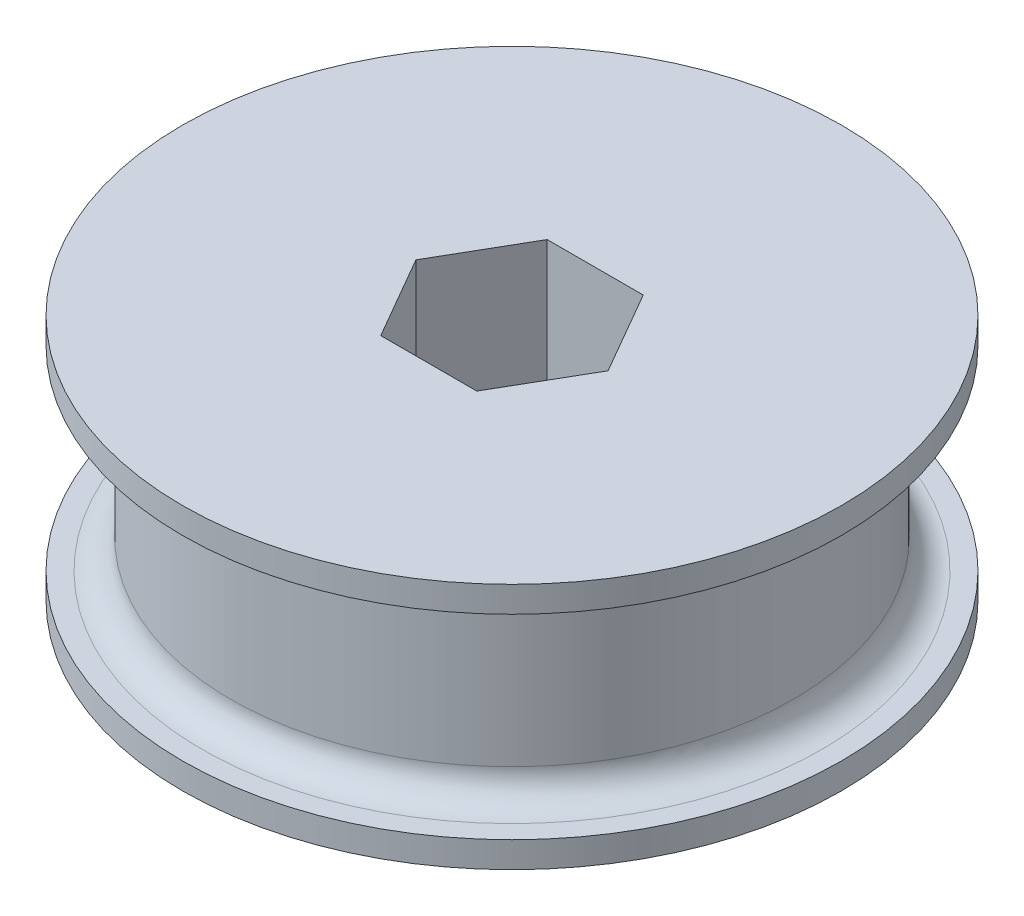
ISO-10303-21;
HEADER;
FILE_DESCRIPTION(('STEP AP214'),'2;1');
FILE_NAME('part.step','',(''),(''),'','','');
FILE_SCHEMA(('AUTOMOTIVE_DESIGN { 1 0 10303 214 1 1 1 1 }'));
ENDSEC;
DATA;
#1=APPLICATION_CONTEXT('core data for automotive mechanical design processes');
#2=APPLICATION_PROTOCOL_DEFINITION('international standard','automotive_design',2000,#1);
#3=PRODUCT_CONTEXT('',#1,'mechanical');
#4=PRODUCT('Part','Part','',(#3));
#5=PRODUCT_RELATED_PRODUCT_CATEGORY('part','',(#4));
#6=PRODUCT_DEFINITION_FORMATION('','',#4);
#7=PRODUCT_DEFINITION_CONTEXT('part definition',#1,'design');
#8=PRODUCT_DEFINITION('design','',#6,#7);
#9=PRODUCT_DEFINITION_SHAPE('','',#8);
#10=(LENGTH_UNIT() NAMED_UNIT(*) SI_UNIT(.MILLI.,.METRE.));
#11=(NAMED_UNIT(*) PLANE_ANGLE_UNIT() SI_UNIT($,.RADIAN.));
#12=(NAMED_UNIT(*) SI_UNIT($,.STERADIAN.) SOLID_ANGLE_UNIT());
#13=UNCERTAINTY_MEASURE_WITH_UNIT(LENGTH_MEASURE(1.E-05),#10,'distance_accuracy_value','');
#14=(GEOMETRIC_REPRESENTATION_CONTEXT(3) GLOBAL_UNCERTAINTY_ASSIGNED_CONTEXT((#13)) GLOBAL_UNIT_ASSIGNED_CONTEXT((#10,
#11,#12)) REPRESENTATION_CONTEXT('',''));
#15=CARTESIAN_POINT('',(0.,0.,0.));
#16=DIRECTION('',(0.,0.,1.));
#17=DIRECTION('',(1.,0.,0.));
#18=AXIS2_PLACEMENT_3D('',#15,#16,#17);
#19=CARTESIAN_POINT('',(0.,19.05,0.));
#20=DIRECTION('',(0.,-1.,0.));
#21=DIRECTION('',(0.,0.,-1.));
#22=AXIS2_PLACEMENT_3D('',#19,#20,#21);
#23=CYLINDRICAL_SURFACE('',#22,25.4);
#24=CARTESIAN_POINT('',(0.,2.00025,0.));
#25=DIRECTION('',(0.,-1.,0.));
#26=DIRECTION('',(0.,0.,-1.));
#27=AXIS2_PLACEMENT_3D('',#24,#25,#26);
#28=CIRCLE('',#27,25.4);
#29=CARTESIAN_POINT('',(0.,2.00025,-25.4));
#30=VERTEX_POINT('',#29);
#31=EDGE_CURVE('E111',#30,#30,#28,.T.);
#32=CARTESIAN_POINT('',(0.,0.,0.));
#33=DIRECTION('',(0.,1.,0.));
#34=DIRECTION('',(0.,0.,1.));
#35=AXIS2_PLACEMENT_3D('',#32,#33,#34);
#36=CIRCLE('',#35,25.4);
#37=CARTESIAN_POINT('',(0.,0.,-25.4));
#38=VERTEX_POINT('',#37);
#39=EDGE_CURVE('E37',#38,#38,#36,.T.);
#40=CARTESIAN_POINT('',(0.,2.00025,-25.4));
#41=CARTESIAN_POINT('',(0.,1.9794140625,-25.4));
#42=CARTESIAN_POINT('',(0.,1.958578125,-25.4));
#43=CARTESIAN_POINT('',(0.,1.91690625,-25.4));
#44=CARTESIAN_POINT('',(0.,1.8960703125,-25.4));
#45=CARTESIAN_POINT('',(0.,1.8543984375,-25.4));
#46=CARTESIAN_POINT('',(0.,1.8335625,-25.4));
#47=CARTESIAN_POINT('',(0.,1.791890625,-25.4));
#48=CARTESIAN_POINT('',(0.,1.7710546875,-25.4));
#49=CARTESIAN_POINT('',(0.,1.7293828125,-25.4));
#50=CARTESIAN_POINT('',(0.,1.708546875,-25.4));
#51=CARTESIAN_POINT('',(0.,1.666875,-25.4));
#52=CARTESIAN_POINT('',(0.,1.6460390625,-25.4));
#53=CARTESIAN_POINT('',(0.,1.6043671875,-25.4));
#54=CARTESIAN_POINT('',(0.,1.58353125,-25.4));
#55=CARTESIAN_POINT('',(0.,1.541859375,-25.4));
#56=CARTESIAN_POINT('',(0.,1.5210234375,-25.4));
#57=CARTESIAN_POINT('',(0.,1.4793515625,-25.4));
#58=CARTESIAN_POINT('',(0.,1.458515625,-25.4));
#59=CARTESIAN_POINT('',(0.,1.41684375,-25.4));
#60=CARTESIAN_POINT('',(0.,1.3960078125,-25.4));
#61=CARTESIAN_POINT('',(0.,1.3543359375,-25.4));
#62=CARTESIAN_POINT('',(0.,1.3335,-25.4));
#63=CARTESIAN_POINT('',(0.,1.291828125,-25.4));
#64=CARTESIAN_POINT('',(0.,1.2709921875,-25.4));
#65=CARTESIAN_POINT('',(0.,1.2293203125,-25.4));
#66=CARTESIAN_POINT('',(0.,1.208484375,-25.4));
#67=CARTESIAN_POINT('',(0.,1.1668125,-25.4));
#68=CARTESIAN_POINT('',(0.,1.1459765625,-25.4));
#69=CARTESIAN_POINT('',(0.,1.1043046875,-25.4));
#70=CARTESIAN_POINT('',(0.,1.08346875,-25.4));
#71=CARTESIAN_POINT('',(0.,1.041796875,-25.4));
#72=CARTESIAN_POINT('',(0.,1.0209609375,-25.4));
#73=CARTESIAN_POINT('',(0.,0.979289062500001,-25.4));
#74=CARTESIAN_POINT('',(0.,0.958453125,-25.4));
#75=CARTESIAN_POINT('',(0.,0.916781250000001,-25.4));
#76=CARTESIAN_POINT('',(0.,0.895945312500001,-25.4));
#77=CARTESIAN_POINT('',(0.,0.854273437500002,-25.4));
#78=CARTESIAN_POINT('',(0.,0.833437500000001,-25.4));
#79=CARTESIAN_POINT('',(0.,0.791765625000001,-25.4));
#80=CARTESIAN_POINT('',(0.,0.7709296875,-25.4));
#81=CARTESIAN_POINT('',(0.,0.729257812500001,-25.4));
#82=CARTESIAN_POINT('',(0.,0.708421875000001,-25.4));
#83=CARTESIAN_POINT('',(0.,0.666750000000002,-25.4));
#84=CARTESIAN_POINT('',(0.,0.645914062500001,-25.4));
#85=CARTESIAN_POINT('',(0.,0.604242187500001,-25.4));
#86=CARTESIAN_POINT('',(0.,0.58340625,-25.4));
#87=CARTESIAN_POINT('',(0.,0.541734375000001,-25.4));
#88=CARTESIAN_POINT('',(0.,0.520898437500002,-25.4));
#89=CARTESIAN_POINT('',(0.,0.479226562500002,-25.4));
#90=CARTESIAN_POINT('',(0.,0.458390625000001,-25.4));
#91=CARTESIAN_POINT('',(0.,0.416718750000001,-25.4));
#92=CARTESIAN_POINT('',(0.,0.3958828125,-25.4));
#93=CARTESIAN_POINT('',(0.,0.3542109375,-25.4));
#94=CARTESIAN_POINT('',(0.,0.333374999999999,-25.4));
#95=CARTESIAN_POINT('',(0.,0.291703125,-25.4));
#96=CARTESIAN_POINT('',(0.,0.2708671875,-25.4));
#97=CARTESIAN_POINT('',(0.,0.229195312500001,-25.4));
#98=CARTESIAN_POINT('',(0.,0.208359375,-25.4));
#99=CARTESIAN_POINT('',(0.,0.1666875,-25.4));
#100=CARTESIAN_POINT('',(0.,0.145851562499999,-25.4));
#101=CARTESIAN_POINT('',(0.,0.1041796875,-25.4));
#102=CARTESIAN_POINT('',(0.,0.0833437500000004,-25.4));
#103=CARTESIAN_POINT('',(0.,0.0416718750000008,-25.4));
#104=CARTESIAN_POINT('',(0.,0.0208359375000004,-25.4));
#105=CARTESIAN_POINT('',(0.,0.,-25.4));
#106=B_SPLINE_CURVE_WITH_KNOTS('',3,(#40,#41,#42,#43,#44,#45,#46,#47,#48,#49,#50,#51,#52,#53,
#54,#55,#56,#57,#58,#59,#60,#61,#62,#63,#64,#65,#66,#67,#68,#69,#70,#71,#72,#73,#74,#75,#76,#77,
#78,#79,#80,#81,#82,#83,#84,#85,#86,#87,#88,#89,#90,#91,#92,#93,#94,#95,#96,#97,#98,#99,#100,
#101,#102,#103,#104,#105),.UNSPECIFIED.,.F.,.F.,(4,2,2,2,2,2,2,2,2,2,2,2,2,2,2,2,2,2,2,2,2,2,2,
2,2,2,2,2,2,2,2,2,4),(0.,0.0625078125000011,0.125015624999999,0.1875234375,0.250031250000001,
0.312539062499999,0.375046875,0.437554687500001,0.500062500000002,0.5625703125,
0.625078125000001,0.687585937500002,0.75009375,0.812601562500001,0.875109375000002,0.9376171875,
1.000125,1.0626328125,1.125140625,1.1876484375,1.25015625,1.3126640625,1.375171875,1.4376796875,
1.5001875,1.5626953125,1.625203125,1.6877109375,1.75021875,1.8127265625,1.875234375,
1.9377421875,2.00025),.UNSPECIFIED.);
#107=EDGE_CURVE('BSEAM33',#30,#38,#106,.T.);
#108=ORIENTED_EDGE('',*,*,#31,.T.);
#109=ORIENTED_EDGE('',*,*,#39,.T.);
#110=ORIENTED_EDGE('',*,*,#107,.T.);
#111=ORIENTED_EDGE('',*,*,#107,.F.);
#112=EDGE_LOOP('',(#108,#110,#109,#111));
#113=FACE_BOUND('',#112,.T.);
#114=ADVANCED_FACE('F33',(#113),#23,.T.);
#115=CARTESIAN_POINT('',(0.,19.05,0.));
#116=DIRECTION('',(0.,1.,0.));
#117=DIRECTION('',(0.,0.,1.));
#118=AXIS2_PLACEMENT_3D('',#115,#116,#117);
#119=PLANE('',#118);
#120=DIRECTION('',(1.,0.,0.));
#121=VECTOR('',#120,1.);
#122=CARTESIAN_POINT('',(-3.70283595144767,19.05,6.4135));
#123=LINE('',#122,#121);
#124=CARTESIAN_POINT('',(-3.70283595144767,19.05,6.4135));
#125=VERTEX_POINT('',#124);
#126=CARTESIAN_POINT('',(3.70283595144767,19.05,6.4135));
#127=VERTEX_POINT('',#126);
#128=EDGE_CURVE('E48',#125,#127,#123,.T.);
#129=ORIENTED_EDGE('',*,*,#128,.F.);
#130=DIRECTION('',(0.5,0.,0.866025403784439));
#131=VECTOR('',#130,1.);
#132=CARTESIAN_POINT('',(-7.40567190289533,19.05,0.));
#133=LINE('',#132,#131);
#134=CARTESIAN_POINT('',(-7.40567190289533,19.05,0.));
#135=VERTEX_POINT('',#134);
#136=EDGE_CURVE('E105',#135,#125,#133,.T.);
#137=ORIENTED_EDGE('',*,*,#136,.F.);
#138=DIRECTION('',(-0.5,0.,0.866025403784439));
#139=VECTOR('',#138,1.);
#140=CARTESIAN_POINT('',(-3.70283595144767,19.05,-6.4135));
#141=LINE('',#140,#139);
#142=CARTESIAN_POINT('',(-3.70283595144767,19.05,-6.4135));
#143=VERTEX_POINT('',#142);
#144=EDGE_CURVE('E108',#143,#135,#141,.T.);
#145=ORIENTED_EDGE('',*,*,#144,.F.);
#146=DIRECTION('',(-1.,0.,0.));
#147=VECTOR('',#146,1.);
#148=CARTESIAN_POINT('',(3.70283595144766,19.05,-6.4135));
#149=LINE('',#148,#147);
#150=CARTESIAN_POINT('',(3.70283595144766,19.05,-6.4135));
#151=VERTEX_POINT('',#150);
#152=EDGE_CURVE('E127',#151,#143,#149,.T.);
#153=ORIENTED_EDGE('',*,*,#152,.F.);
#154=DIRECTION('',(-0.5,0.,-0.866025403784439));
#155=VECTOR('',#154,1.);
#156=CARTESIAN_POINT('',(7.40567190289533,19.05,0.));
#157=LINE('',#156,#155);
#158=CARTESIAN_POINT('',(7.40567190289533,19.05,0.));
#159=VERTEX_POINT('',#158);
#160=EDGE_CURVE('E124',#159,#151,#157,.T.);
#161=ORIENTED_EDGE('',*,*,#160,.F.);
#162=DIRECTION('',(0.5,0.,-0.866025403784439));
#163=VECTOR('',#162,1.);
#164=CARTESIAN_POINT('',(3.70283595144767,19.05,6.4135));
#165=LINE('',#164,#163);
#166=EDGE_CURVE('E122',#127,#159,#165,.T.);
#167=ORIENTED_EDGE('',*,*,#166,.F.);
#168=EDGE_LOOP('',(#129,#137,#145,#153,#161,#167));
#169=FACE_BOUND('',#168,.T.);
#170=CARTESIAN_POINT('',(0.,19.05,0.));
#171=DIRECTION('',(0.,1.,0.));
#172=DIRECTION('',(0.,0.,1.));
#173=AXIS2_PLACEMENT_3D('',#170,#171,#172);
#174=CIRCLE('',#173,25.4);
#175=CARTESIAN_POINT('',(0.,19.05,-25.4));
#176=VERTEX_POINT('',#175);
#177=EDGE_CURVE('E11',#176,#176,#174,.T.);
#178=ORIENTED_EDGE('',*,*,#177,.T.);
#179=EDGE_LOOP('',(#178));
#180=FACE_BOUND('',#179,.T.);
#181=ADVANCED_FACE('F144',(#169,#180),#119,.T.);
#182=CARTESIAN_POINT('',(0.,0.,0.));
#183=DIRECTION('',(0.,1.,0.));
#184=DIRECTION('',(0.,0.,1.));
#185=AXIS2_PLACEMENT_3D('',#182,#183,#184);
#186=PLANE('',#185);
#187=DIRECTION('',(0.5,0.,0.866025403784439));
#188=VECTOR('',#187,1.);
#189=CARTESIAN_POINT('',(-7.40567190289533,0.,0.));
#190=LINE('',#189,#188);
#191=CARTESIAN_POINT('',(-7.40567190289533,0.,0.));
#192=VERTEX_POINT('',#191);
#193=CARTESIAN_POINT('',(-3.70283595144767,0.,6.4135));
#194=VERTEX_POINT('',#193);
#195=EDGE_CURVE('E94',#192,#194,#190,.T.);
#196=ORIENTED_EDGE('',*,*,#195,.T.);
#197=DIRECTION('',(1.,0.,0.));
#198=VECTOR('',#197,1.);
#199=CARTESIAN_POINT('',(-3.70283595144767,0.,6.4135));
#200=LINE('',#199,#198);
#201=CARTESIAN_POINT('',(3.70283595144767,0.,6.4135));
#202=VERTEX_POINT('',#201);
#203=EDGE_CURVE('E88',#194,#202,#200,.T.);
#204=ORIENTED_EDGE('',*,*,#203,.T.);
#205=DIRECTION('',(0.5,0.,-0.866025403784439));
#206=VECTOR('',#205,1.);
#207=CARTESIAN_POINT('',(3.70283595144767,0.,6.4135));
#208=LINE('',#207,#206);
#209=CARTESIAN_POINT('',(7.40567190289533,0.,0.));
#210=VERTEX_POINT('',#209);
#211=EDGE_CURVE('E97',#202,#210,#208,.T.);
#212=ORIENTED_EDGE('',*,*,#211,.T.);
#213=DIRECTION('',(-0.5,0.,-0.866025403784439));
#214=VECTOR('',#213,1.);
#215=CARTESIAN_POINT('',(7.40567190289533,0.,0.));
#216=LINE('',#215,#214);
#217=CARTESIAN_POINT('',(3.70283595144766,0.,-6.4135));
#218=VERTEX_POINT('',#217);
#219=EDGE_CURVE('E56',#210,#218,#216,.T.);
#220=ORIENTED_EDGE('',*,*,#219,.T.);
#221=DIRECTION('',(-1.,0.,0.));
#222=VECTOR('',#221,1.);
#223=CARTESIAN_POINT('',(3.70283595144766,0.,-6.4135));
#224=LINE('',#223,#222);
#225=CARTESIAN_POINT('',(-3.70283595144767,0.,-6.4135));
#226=VERTEX_POINT('',#225);
#227=EDGE_CURVE('E115',#218,#226,#224,.T.);
#228=ORIENTED_EDGE('',*,*,#227,.T.);
#229=DIRECTION('',(-0.5,0.,0.866025403784439));
#230=VECTOR('',#229,1.);
#231=CARTESIAN_POINT('',(-3.70283595144767,0.,-6.4135));
#232=LINE('',#231,#230);
#233=EDGE_CURVE('E118',#226,#192,#232,.T.);
#234=ORIENTED_EDGE('',*,*,#233,.T.);
#235=EDGE_LOOP('',(#196,#204,#212,#220,#228,#234));
#236=FACE_BOUND('',#235,.T.);
#237=ORIENTED_EDGE('',*,*,#39,.F.);
#238=EDGE_LOOP('',(#237));
#239=FACE_BOUND('',#238,.T.);
#240=ADVANCED_FACE('F101',(#236,#239),#186,.F.);
#241=CARTESIAN_POINT('',(0.,17.04975,0.));
#242=DIRECTION('',(0.,-1.,0.));
#243=DIRECTION('',(0.,0.,-1.));
#244=AXIS2_PLACEMENT_3D('',#241,#242,#243);
#245=CIRCLE('',#244,25.4);
#246=CARTESIAN_POINT('',(0.,17.04975,-25.4));
#247=VERTEX_POINT('',#246);
#248=EDGE_CURVE('E181',#247,#247,#245,.T.);
#249=CARTESIAN_POINT('',(0.,17.04975,-25.4));
#250=CARTESIAN_POINT('',(0.,17.0705859375,-25.4));
#251=CARTESIAN_POINT('',(0.,17.091421875,-25.4));
#252=CARTESIAN_POINT('',(0.,17.13309375,-25.4));
#253=CARTESIAN_POINT('',(0.,17.1539296875,-25.4));
#254=CARTESIAN_POINT('',(0.,17.1956015625,-25.4));
#255=CARTESIAN_POINT('',(0.,17.2164375,-25.4));
#256=CARTESIAN_POINT('',(0.,17.258109375,-25.4));
#257=CARTESIAN_POINT('',(0.,17.2789453125,-25.4));
#258=CARTESIAN_POINT('',(0.,17.3206171875,-25.4));
#259=CARTESIAN_POINT('',(0.,17.341453125,-25.4));
#260=CARTESIAN_POINT('',(0.,17.383125,-25.4));
#261=CARTESIAN_POINT('',(0.,17.4039609375,-25.4));
#262=CARTESIAN_POINT('',(0.,17.4456328125,-25.4));
#263=CARTESIAN_POINT('',(0.,17.46646875,-25.4));
#264=CARTESIAN_POINT('',(0.,17.508140625,-25.4));
#265=CARTESIAN_POINT('',(0.,17.5289765625,-25.4));
#266=CARTESIAN_POINT('',(0.,17.5706484375,-25.4));
#267=CARTESIAN_POINT('',(0.,17.591484375,-25.4));
#268=CARTESIAN_POINT('',(0.,17.63315625,-25.4));
#269=CARTESIAN_POINT('',(0.,17.6539921875,-25.4));
#270=CARTESIAN_POINT('',(0.,17.6956640625,-25.4));
#271=CARTESIAN_POINT('',(0.,17.7165,-25.4));
#272=CARTESIAN_POINT('',(0.,17.758171875,-25.4));
#273=CARTESIAN_POINT('',(0.,17.7790078125,-25.4));
#274=CARTESIAN_POINT('',(0.,17.8206796875,-25.4));
#275=CARTESIAN_POINT('',(0.,17.841515625,-25.4));
#276=CARTESIAN_POINT('',(0.,17.8831875,-25.4));
#277=CARTESIAN_POINT('',(0.,17.9040234375,-25.4));
#278=CARTESIAN_POINT('',(0.,17.9456953125,-25.4));
#279=CARTESIAN_POINT('',(0.,17.96653125,-25.4));
#280=CARTESIAN_POINT('',(0.,18.008203125,-25.4));
#281=CARTESIAN_POINT('',(0.,18.0290390625,-25.4));
#282=CARTESIAN_POINT('',(0.,18.0707109375,-25.4));
#283=CARTESIAN_POINT('',(0.,18.091546875,-25.4));
#284=CARTESIAN_POINT('',(0.,18.13321875,-25.4));
#285=CARTESIAN_POINT('',(0.,18.1540546875,-25.4));
#286=CARTESIAN_POINT('',(0.,18.1957265625,-25.4));
#287=CARTESIAN_POINT('',(0.,18.2165625,-25.4));
#288=CARTESIAN_POINT('',(0.,18.258234375,-25.4));
#289=CARTESIAN_POINT('',(0.,18.2790703125,-25.4));
#290=CARTESIAN_POINT('',(0.,18.3207421875,-25.4));
#291=CARTESIAN_POINT('',(0.,18.341578125,-25.4));
#292=CARTESIAN_POINT('',(0.,18.38325,-25.4));
#293=CARTESIAN_POINT('',(0.,18.4040859375,-25.4));
#294=CARTESIAN_POINT('',(0.,18.4457578125,-25.4));
#295=CARTESIAN_POINT('',(0.,18.46659375,-25.4));
#296=CARTESIAN_POINT('',(0.,18.508265625,-25.4));
#297=CARTESIAN_POINT('',(0.,18.5291015625,-25.4));
#298=CARTESIAN_POINT('',(0.,18.5707734375,-25.4));
#299=CARTESIAN_POINT('',(0.,18.591609375,-25.4));
#300=CARTESIAN_POINT('',(0.,18.63328125,-25.4));
#301=CARTESIAN_POINT('',(0.,18.6541171875,-25.4));
#302=CARTESIAN_POINT('',(0.,18.6957890625,-25.4));
#303=CARTESIAN_POINT('',(0.,18.716625,-25.4));
#304=CARTESIAN_POINT('',(0.,18.758296875,-25.4));
#305=CARTESIAN_POINT('',(0.,18.7791328125,-25.4));
#306=CARTESIAN_POINT('',(0.,18.8208046875,-25.4));
#307=CARTESIAN_POINT('',(0.,18.841640625,-25.4));
#308=CARTESIAN_POINT('',(0.,18.8833125,-25.4));
#309=CARTESIAN_POINT('',(0.,18.9041484375,-25.4));
#310=CARTESIAN_POINT('',(0.,18.9458203125,-25.4));
#311=CARTESIAN_POINT('',(0.,18.96665625,-25.4));
#312=CARTESIAN_POINT('',(0.,19.008328125,-25.4));
#313=CARTESIAN_POINT('',(0.,19.0291640625,-25.4));
#314=CARTESIAN_POINT('',(0.,19.05,-25.4));
#315=B_SPLINE_CURVE_WITH_KNOTS('',3,(#249,#250,#251,#252,#253,#254,#255,#256,#257,#258,#259,
#260,#261,#262,#263,#264,#265,#266,#267,#268,#269,#270,#271,#272,#273,#274,#275,#276,#277,#278,
#279,#280,#281,#282,#283,#284,#285,#286,#287,#288,#289,#290,#291,#292,#293,#294,#295,#296,#297,
#298,#299,#300,#301,#302,#303,#304,#305,#306,#307,#308,#309,#310,#311,#312,#313,#314),
.UNSPECIFIED.,.F.,.F.,(4,2,2,2,2,2,2,2,2,2,2,2,2,2,2,2,2,2,2,2,2,2,2,2,2,2,2,2,2,2,2,2,4),(0.,
0.0625078124999977,0.125015624999999,0.187523437499997,0.250031249999998,0.312539062499999,
0.375046874999996,0.437554687499998,0.500062499999999,0.562570312499996,0.625078124999998,
0.687585937499995,0.750093749999996,0.812601562499998,0.875109374999995,0.937617187499996,
1.000125,1.0626328125,1.125140625,1.18764843749999,1.25015625,1.3126640625,1.37517187499999,
1.4376796875,1.5001875,1.56269531249999,1.625203125,1.68771093749999,1.75021874999999,
1.8127265625,1.87523437499999,1.93774218749999,2.00024999999999),.UNSPECIFIED.);
#316=EDGE_CURVE('BSEAM35',#247,#176,#315,.T.);
#317=ORIENTED_EDGE('',*,*,#248,.F.);
#318=ORIENTED_EDGE('',*,*,#177,.F.);
#319=ORIENTED_EDGE('',*,*,#316,.T.);
#320=ORIENTED_EDGE('',*,*,#316,.F.);
#321=EDGE_LOOP('',(#317,#319,#318,#320));
#322=FACE_BOUND('',#321,.T.);
#323=ADVANCED_FACE('F35',(#322),#23,.T.);
#324=CARTESIAN_POINT('',(-3.70283595144767,0.,6.4135));
#325=DIRECTION('',(0.,0.,1.));
#326=DIRECTION('',(1.,0.,0.));
#327=AXIS2_PLACEMENT_3D('',#324,#325,#326);
#328=PLANE('',#327);
#329=ORIENTED_EDGE('',*,*,#128,.T.);
#330=DIRECTION('',(0.,1.,0.));
#331=VECTOR('',#330,1.);
#332=CARTESIAN_POINT('',(3.70283595144767,0.,6.4135));
#333=LINE('',#332,#331);
#334=EDGE_CURVE('E84',#202,#127,#333,.T.);
#335=ORIENTED_EDGE('',*,*,#334,.F.);
#336=ORIENTED_EDGE('',*,*,#203,.F.);
#337=DIRECTION('',(0.,1.,0.));
#338=VECTOR('',#337,1.);
#339=CARTESIAN_POINT('',(-3.70283595144767,0.,6.4135));
#340=LINE('',#339,#338);
#341=EDGE_CURVE('E132',#194,#125,#340,.T.);
#342=ORIENTED_EDGE('',*,*,#341,.T.);
#343=EDGE_LOOP('',(#329,#335,#336,#342));
#344=FACE_BOUND('',#343,.T.);
#345=ADVANCED_FACE('F86',(#344),#328,.F.);
#346=CARTESIAN_POINT('',(-7.40567190289533,0.,0.));
#347=DIRECTION('',(-0.866025403784439,0.,0.5));
#348=DIRECTION('',(0.5,0.,0.866025403784438));
#349=AXIS2_PLACEMENT_3D('',#346,#347,#348);
#350=PLANE('',#349);
#351=ORIENTED_EDGE('',*,*,#136,.T.);
#352=ORIENTED_EDGE('',*,*,#341,.F.);
#353=ORIENTED_EDGE('',*,*,#195,.F.);
#354=DIRECTION('',(0.,1.,0.));
#355=VECTOR('',#354,1.);
#356=CARTESIAN_POINT('',(-7.40567190289533,0.,0.));
#357=LINE('',#356,#355);
#358=EDGE_CURVE('E134',#192,#135,#357,.T.);
#359=ORIENTED_EDGE('',*,*,#358,.T.);
#360=EDGE_LOOP('',(#351,#352,#353,#359));
#361=FACE_BOUND('',#360,.T.);
#362=ADVANCED_FACE('F155',(#361),#350,.F.);
#363=CARTESIAN_POINT('',(-3.70283595144767,0.,-6.4135));
#364=DIRECTION('',(-0.866025403784439,0.,-0.5));
#365=DIRECTION('',(-0.5,0.,0.866025403784439));
#366=AXIS2_PLACEMENT_3D('',#363,#364,#365);
#367=PLANE('',#366);
#368=ORIENTED_EDGE('',*,*,#144,.T.);
#369=ORIENTED_EDGE('',*,*,#358,.F.);
#370=ORIENTED_EDGE('',*,*,#233,.F.);
#371=DIRECTION('',(0.,1.,0.));
#372=VECTOR('',#371,1.);
#373=CARTESIAN_POINT('',(-3.70283595144767,0.,-6.4135));
#374=LINE('',#373,#372);
#375=EDGE_CURVE('E136',#226,#143,#374,.T.);
#376=ORIENTED_EDGE('',*,*,#375,.T.);
#377=EDGE_LOOP('',(#368,#369,#370,#376));
#378=FACE_BOUND('',#377,.T.);
#379=ADVANCED_FACE('F153',(#378),#367,.F.);
#380=CARTESIAN_POINT('',(3.70283595144766,0.,-6.4135));
#381=DIRECTION('',(0.,0.,-1.));
#382=DIRECTION('',(-1.,0.,0.));
#383=AXIS2_PLACEMENT_3D('',#380,#381,#382);
#384=PLANE('',#383);
#385=ORIENTED_EDGE('',*,*,#152,.T.);
#386=ORIENTED_EDGE('',*,*,#375,.F.);
#387=ORIENTED_EDGE('',*,*,#227,.F.);
#388=DIRECTION('',(0.,1.,0.));
#389=VECTOR('',#388,1.);
#390=CARTESIAN_POINT('',(3.70283595144766,0.,-6.4135));
#391=LINE('',#390,#389);
#392=EDGE_CURVE('E138',#218,#151,#391,.T.);
#393=ORIENTED_EDGE('',*,*,#392,.T.);
#394=EDGE_LOOP('',(#385,#386,#387,#393));
#395=FACE_BOUND('',#394,.T.);
#396=ADVANCED_FACE('F149',(#395),#384,.F.);
#397=CARTESIAN_POINT('',(7.40567190289533,0.,0.));
#398=DIRECTION('',(0.866025403784439,0.,-0.5));
#399=DIRECTION('',(-0.5,0.,-0.866025403784438));
#400=AXIS2_PLACEMENT_3D('',#397,#398,#399);
#401=PLANE('',#400);
#402=ORIENTED_EDGE('',*,*,#160,.T.);
#403=ORIENTED_EDGE('',*,*,#392,.F.);
#404=ORIENTED_EDGE('',*,*,#219,.F.);
#405=DIRECTION('',(0.,1.,0.));
#406=VECTOR('',#405,1.);
#407=CARTESIAN_POINT('',(7.40567190289533,0.,0.));
#408=LINE('',#407,#406);
#409=EDGE_CURVE('E93',#210,#159,#408,.T.);
#410=ORIENTED_EDGE('',*,*,#409,.T.);
#411=EDGE_LOOP('',(#402,#403,#404,#410));
#412=FACE_BOUND('',#411,.T.);
#413=ADVANCED_FACE('F140',(#412),#401,.F.);
#414=CARTESIAN_POINT('',(3.70283595144767,0.,6.4135));
#415=DIRECTION('',(0.866025403784439,0.,0.5));
#416=DIRECTION('',(0.5,0.,-0.866025403784439));
#417=AXIS2_PLACEMENT_3D('',#414,#415,#416);
#418=PLANE('',#417);
#419=ORIENTED_EDGE('',*,*,#166,.T.);
#420=ORIENTED_EDGE('',*,*,#409,.F.);
#421=ORIENTED_EDGE('',*,*,#211,.F.);
#422=ORIENTED_EDGE('',*,*,#334,.T.);
#423=EDGE_LOOP('',(#419,#420,#421,#422));
#424=FACE_BOUND('',#423,.T.);
#425=ADVANCED_FACE('F98',(#424),#418,.F.);
#426=CARTESIAN_POINT('',(25.4,2.00025,0.));
#427=DIRECTION('',(0.,-1.,0.));
#428=DIRECTION('',(0.,0.,-1.));
#429=AXIS2_PLACEMENT_3D('',#426,#427,#428);
#430=PLANE('',#429);
#431=ORIENTED_EDGE('',*,*,#31,.F.);
#432=EDGE_LOOP('',(#431));
#433=FACE_BOUND('',#432,.T.);
#434=CARTESIAN_POINT('',(0.,2.00025,0.));
#435=DIRECTION('',(0.,-1.,0.));
#436=DIRECTION('',(0.,0.,-1.));
#437=AXIS2_PLACEMENT_3D('',#434,#435,#436);
#438=CIRCLE('',#437,23.876);
#439=CARTESIAN_POINT('',(0.,2.00025,-23.876));
#440=VERTEX_POINT('',#439);
#441=EDGE_CURVE('E194',#440,#440,#438,.T.);
#442=ORIENTED_EDGE('',*,*,#441,.T.);
#443=EDGE_LOOP('',(#442));
#444=FACE_BOUND('',#443,.T.);
#445=ADVANCED_FACE('F200',(#433,#444),#430,.F.);
#446=CARTESIAN_POINT('',(0.,4.22275,0.));
#447=DIRECTION('',(0.,-1.,0.));
#448=DIRECTION('',(0.,0.,-1.));
#449=AXIS2_PLACEMENT_3D('',#446,#447,#448);
#450=TOROIDAL_SURFACE('',#449,23.876,2.2225);
#451=ORIENTED_EDGE('',*,*,#441,.F.);
#452=EDGE_LOOP('',(#451));
#453=FACE_BOUND('',#452,.T.);
#454=CARTESIAN_POINT('',(0.,4.22275,0.));
#455=DIRECTION('',(0.,-1.,0.));
#456=DIRECTION('',(0.,0.,-1.));
#457=AXIS2_PLACEMENT_3D('',#454,#455,#456);
#458=CIRCLE('',#457,21.6535);
#459=CARTESIAN_POINT('',(0.,4.22275,-21.6535));
#460=VERTEX_POINT('',#459);
#461=EDGE_CURVE('E192',#460,#460,#458,.T.);
#462=ORIENTED_EDGE('',*,*,#461,.T.);
#463=EDGE_LOOP('',(#462));
#464=FACE_BOUND('',#463,.T.);
#465=ADVANCED_FACE('F202',(#453,#464),#450,.F.);
#466=CARTESIAN_POINT('',(0.,0.,0.));
#467=DIRECTION('',(0.,-1.,0.));
#468=DIRECTION('',(0.,0.,-1.));
#469=AXIS2_PLACEMENT_3D('',#466,#467,#468);
#470=CYLINDRICAL_SURFACE('',#469,21.6535);
#471=ORIENTED_EDGE('',*,*,#461,.F.);
#472=EDGE_LOOP('',(#471));
#473=FACE_BOUND('',#472,.T.);
#474=CARTESIAN_POINT('',(0.,14.82725,0.));
#475=DIRECTION('',(0.,-1.,0.));
#476=DIRECTION('',(0.,0.,-1.));
#477=AXIS2_PLACEMENT_3D('',#474,#475,#476);
#478=CIRCLE('',#477,21.6535);
#479=CARTESIAN_POINT('',(0.,14.82725,-21.6535));
#480=VERTEX_POINT('',#479);
#481=EDGE_CURVE('E187',#480,#480,#478,.T.);
#482=ORIENTED_EDGE('',*,*,#481,.T.);
#483=EDGE_LOOP('',(#482));
#484=FACE_BOUND('',#483,.T.);
#485=ADVANCED_FACE('F207',(#473,#484),#470,.T.);
#486=CARTESIAN_POINT('',(0.,14.82725,0.));
#487=DIRECTION('',(0.,-1.,0.));
#488=DIRECTION('',(0.,0.,-1.));
#489=AXIS2_PLACEMENT_3D('',#486,#487,#488);
#490=TOROIDAL_SURFACE('',#489,23.876,2.2225);
#491=ORIENTED_EDGE('',*,*,#481,.F.);
#492=EDGE_LOOP('',(#491));
#493=FACE_BOUND('',#492,.T.);
#494=CARTESIAN_POINT('',(0.,17.04975,0.));
#495=DIRECTION('',(0.,-1.,0.));
#496=DIRECTION('',(0.,0.,-1.));
#497=AXIS2_PLACEMENT_3D('',#494,#495,#496);
#498=CIRCLE('',#497,23.876);
#499=CARTESIAN_POINT('',(0.,17.04975,-23.876));
#500=VERTEX_POINT('',#499);
#501=EDGE_CURVE('E184',#500,#500,#498,.T.);
#502=ORIENTED_EDGE('',*,*,#501,.T.);
#503=EDGE_LOOP('',(#502));
#504=FACE_BOUND('',#503,.T.);
#505=ADVANCED_FACE('F214',(#493,#504),#490,.F.);
#506=CARTESIAN_POINT('',(25.4,17.04975,0.));
#507=DIRECTION('',(0.,1.,0.));
#508=DIRECTION('',(0.,0.,1.));
#509=AXIS2_PLACEMENT_3D('',#506,#507,#508);
#510=PLANE('',#509);
#511=ORIENTED_EDGE('',*,*,#501,.F.);
#512=EDGE_LOOP('',(#511));
#513=FACE_BOUND('',#512,.T.);
#514=ORIENTED_EDGE('',*,*,#248,.T.);
#515=EDGE_LOOP('',(#514));
#516=FACE_BOUND('',#515,.T.);
#517=ADVANCED_FACE('F218',(#513,#516),#510,.F.);
#518=CLOSED_SHELL('',(#114,#181,#240,#323,#345,#362,#379,#396,#413,#425,#445,#465,#485,#505,#517));
#519=MANIFOLD_SOLID_BREP('B2',#518);
#520=ADVANCED_BREP_SHAPE_REPRESENTATION('',(#18,#519),#14);
#521=SHAPE_DEFINITION_REPRESENTATION(#9,#520);
ENDSEC;
END-ISO-10303-21;
